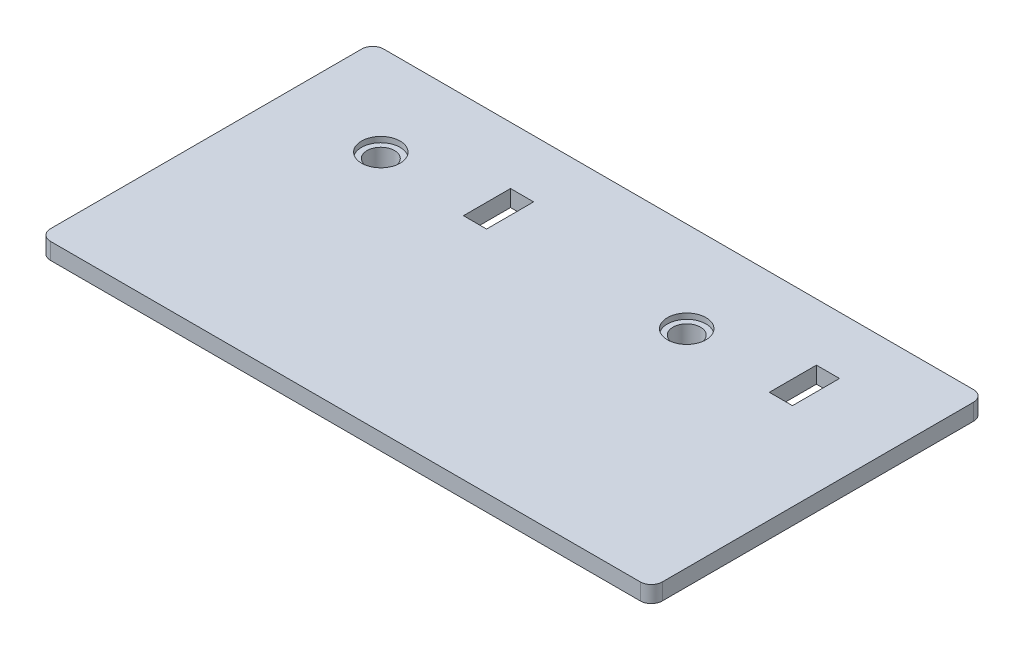
ISO-10303-21;
HEADER;
FILE_DESCRIPTION(('STEP AP214'),'2;1');
FILE_NAME('part.step','',(''),(''),'','','');
FILE_SCHEMA(('AUTOMOTIVE_DESIGN { 1 0 10303 214 1 1 1 1 }'));
ENDSEC;
DATA;
#1=APPLICATION_CONTEXT('core data for automotive mechanical design processes');
#2=APPLICATION_PROTOCOL_DEFINITION('international standard','automotive_design',2000,#1);
#3=PRODUCT_CONTEXT('',#1,'mechanical');
#4=PRODUCT('Part','Part','',(#3));
#5=PRODUCT_RELATED_PRODUCT_CATEGORY('part','',(#4));
#6=PRODUCT_DEFINITION_FORMATION('','',#4);
#7=PRODUCT_DEFINITION_CONTEXT('part definition',#1,'design');
#8=PRODUCT_DEFINITION('design','',#6,#7);
#9=PRODUCT_DEFINITION_SHAPE('','',#8);
#10=(LENGTH_UNIT() NAMED_UNIT(*) SI_UNIT(.MILLI.,.METRE.));
#11=(NAMED_UNIT(*) PLANE_ANGLE_UNIT() SI_UNIT($,.RADIAN.));
#12=(NAMED_UNIT(*) SI_UNIT($,.STERADIAN.) SOLID_ANGLE_UNIT());
#13=UNCERTAINTY_MEASURE_WITH_UNIT(LENGTH_MEASURE(1.E-05),#10,'distance_accuracy_value','');
#14=(GEOMETRIC_REPRESENTATION_CONTEXT(3) GLOBAL_UNCERTAINTY_ASSIGNED_CONTEXT((#13)) GLOBAL_UNIT_ASSIGNED_CONTEXT((#10,
#11,#12)) REPRESENTATION_CONTEXT('',''));
#15=CARTESIAN_POINT('',(0.,0.,0.));
#16=DIRECTION('',(0.,0.,1.));
#17=DIRECTION('',(1.,0.,0.));
#18=AXIS2_PLACEMENT_3D('',#15,#16,#17);
#19=CARTESIAN_POINT('',(0.,0.,0.));
#20=DIRECTION('',(0.,1.,0.));
#21=DIRECTION('',(0.,0.,1.));
#22=AXIS2_PLACEMENT_3D('',#19,#20,#21);
#23=PLANE('',#22);
#24=CARTESIAN_POINT('',(17.95,0.,-13.78));
#25=DIRECTION('',(0.,1.,0.));
#26=DIRECTION('',(0.,0.,1.));
#27=AXIS2_PLACEMENT_3D('',#24,#25,#26);
#28=CIRCLE('',#27,3.5);
#29=CARTESIAN_POINT('',(17.95,0.,-10.28));
#30=VERTEX_POINT('',#29);
#31=EDGE_CURVE('E43',#30,#30,#28,.F.);
#32=ORIENTED_EDGE('',*,*,#31,.F.);
#33=EDGE_LOOP('',(#32));
#34=FACE_BOUND('',#33,.T.);
#35=DIRECTION('',(1.,0.,0.));
#36=VECTOR('',#35,1.);
#37=CARTESIAN_POINT('',(0.,0.,-11.28));
#38=LINE('',#37,#36);
#39=CARTESIAN_POINT('',(35.45,0.,-11.28));
#40=VERTEX_POINT('',#39);
#41=CARTESIAN_POINT('',(39.65,0.,-11.28));
#42=VERTEX_POINT('',#41);
#43=EDGE_CURVE('E261',#40,#42,#38,.T.);
#44=ORIENTED_EDGE('',*,*,#43,.T.);
#45=DIRECTION('',(0.,0.,-1.));
#46=VECTOR('',#45,1.);
#47=CARTESIAN_POINT('',(39.65,0.,0.));
#48=LINE('',#47,#46);
#49=CARTESIAN_POINT('',(39.65,0.,-19.83));
#50=VERTEX_POINT('',#49);
#51=EDGE_CURVE('E264',#42,#50,#48,.T.);
#52=ORIENTED_EDGE('',*,*,#51,.T.);
#53=DIRECTION('',(-1.,0.,0.));
#54=VECTOR('',#53,1.);
#55=CARTESIAN_POINT('',(0.,0.,-19.83));
#56=LINE('',#55,#54);
#57=CARTESIAN_POINT('',(35.45,0.,-19.83));
#58=VERTEX_POINT('',#57);
#59=EDGE_CURVE('E258',#50,#58,#56,.T.);
#60=ORIENTED_EDGE('',*,*,#59,.T.);
#61=DIRECTION('',(0.,0.,1.));
#62=VECTOR('',#61,1.);
#63=CARTESIAN_POINT('',(35.45,0.,0.));
#64=LINE('',#63,#62);
#65=EDGE_CURVE('E201',#58,#40,#64,.T.);
#66=ORIENTED_EDGE('',*,*,#65,.T.);
#67=EDGE_LOOP('',(#44,#52,#60,#66));
#68=FACE_BOUND('',#67,.T.);
#69=DIRECTION('',(1.,0.,0.));
#70=VECTOR('',#69,1.);
#71=CARTESIAN_POINT('',(0.,0.,-11.28));
#72=LINE('',#71,#70);
#73=CARTESIAN_POINT('',(-20.1,0.,-11.28));
#74=VERTEX_POINT('',#73);
#75=CARTESIAN_POINT('',(-15.9,0.,-11.28));
#76=VERTEX_POINT('',#75);
#77=EDGE_CURVE('E252',#74,#76,#72,.T.);
#78=ORIENTED_EDGE('',*,*,#77,.T.);
#79=DIRECTION('',(0.,0.,-1.));
#80=VECTOR('',#79,1.);
#81=CARTESIAN_POINT('',(-15.9,0.,0.));
#82=LINE('',#81,#80);
#83=CARTESIAN_POINT('',(-15.9,0.,-19.83));
#84=VERTEX_POINT('',#83);
#85=EDGE_CURVE('E255',#76,#84,#82,.T.);
#86=ORIENTED_EDGE('',*,*,#85,.T.);
#87=DIRECTION('',(-1.,0.,0.));
#88=VECTOR('',#87,1.);
#89=CARTESIAN_POINT('',(0.,0.,-19.83));
#90=LINE('',#89,#88);
#91=CARTESIAN_POINT('',(-20.1,0.,-19.83));
#92=VERTEX_POINT('',#91);
#93=EDGE_CURVE('E225',#84,#92,#90,.T.);
#94=ORIENTED_EDGE('',*,*,#93,.T.);
#95=DIRECTION('',(0.,0.,1.));
#96=VECTOR('',#95,1.);
#97=CARTESIAN_POINT('',(-20.1,0.,0.));
#98=LINE('',#97,#96);
#99=EDGE_CURVE('E249',#92,#74,#98,.T.);
#100=ORIENTED_EDGE('',*,*,#99,.T.);
#101=EDGE_LOOP('',(#78,#86,#94,#100));
#102=FACE_BOUND('',#101,.T.);
#103=DIRECTION('',(0.,0.,1.));
#104=VECTOR('',#103,1.);
#105=CARTESIAN_POINT('',(-45.55,0.,-23.25));
#106=LINE('',#105,#104);
#107=CARTESIAN_POINT('',(-45.55,0.,-27.25));
#108=VERTEX_POINT('',#107);
#109=CARTESIAN_POINT('',(-45.55,0.,-23.25));
#110=VERTEX_POINT('',#109);
#111=EDGE_CURVE('E300',#108,#110,#106,.T.);
#112=ORIENTED_EDGE('',*,*,#111,.F.);
#113=DIRECTION('',(1.,0.,0.));
#114=VECTOR('',#113,1.);
#115=CARTESIAN_POINT('',(-50.55,0.,-27.25));
#116=LINE('',#115,#114);
#117=CARTESIAN_POINT('',(-50.55,0.,-27.25));
#118=VERTEX_POINT('',#117);
#119=EDGE_CURVE('E305',#118,#108,#116,.T.);
#120=ORIENTED_EDGE('',*,*,#119,.F.);
#121=DIRECTION('',(0.,0.,-1.));
#122=VECTOR('',#121,1.);
#123=CARTESIAN_POINT('',(-50.55,0.,-23.25));
#124=LINE('',#123,#122);
#125=CARTESIAN_POINT('',(-50.55,0.,-23.25));
#126=VERTEX_POINT('',#125);
#127=EDGE_CURVE('E317',#126,#118,#124,.T.);
#128=ORIENTED_EDGE('',*,*,#127,.F.);
#129=DIRECTION('',(-1.,0.,0.));
#130=VECTOR('',#129,1.);
#131=CARTESIAN_POINT('',(-50.55,0.,-23.25));
#132=LINE('',#131,#130);
#133=EDGE_CURVE('E314',#110,#126,#132,.T.);
#134=ORIENTED_EDGE('',*,*,#133,.F.);
#135=EDGE_LOOP('',(#112,#120,#128,#134));
#136=FACE_BOUND('',#135,.T.);
#137=DIRECTION('',(0.,0.,1.));
#138=VECTOR('',#137,1.);
#139=CARTESIAN_POINT('',(-55.55,0.,30.25));
#140=LINE('',#139,#138);
#141=CARTESIAN_POINT('',(-55.55,0.,-28.25));
#142=VERTEX_POINT('',#141);
#143=CARTESIAN_POINT('',(-55.55,0.,28.25));
#144=VERTEX_POINT('',#143);
#145=EDGE_CURVE('E333',#142,#144,#140,.T.);
#146=ORIENTED_EDGE('',*,*,#145,.F.);
#147=CARTESIAN_POINT('',(-53.55,0.,-28.25));
#148=DIRECTION('',(0.,1.,0.));
#149=DIRECTION('',(0.,0.,1.));
#150=AXIS2_PLACEMENT_3D('',#147,#148,#149);
#151=CIRCLE('',#150,2.);
#152=CARTESIAN_POINT('',(-53.55,0.,-30.25));
#153=VERTEX_POINT('',#152);
#154=EDGE_CURVE('E368',#142,#153,#151,.F.);
#155=ORIENTED_EDGE('',*,*,#154,.T.);
#156=DIRECTION('',(-1.,0.,0.));
#157=VECTOR('',#156,1.);
#158=CARTESIAN_POINT('',(55.55,0.,-30.25));
#159=LINE('',#158,#157);
#160=CARTESIAN_POINT('',(53.55,0.,-30.25));
#161=VERTEX_POINT('',#160);
#162=EDGE_CURVE('E338',#161,#153,#159,.T.);
#163=ORIENTED_EDGE('',*,*,#162,.F.);
#164=CARTESIAN_POINT('',(53.55,0.,-28.25));
#165=DIRECTION('',(0.,1.,0.));
#166=DIRECTION('',(0.,0.,1.));
#167=AXIS2_PLACEMENT_3D('',#164,#165,#166);
#168=CIRCLE('',#167,2.);
#169=CARTESIAN_POINT('',(55.55,0.,-28.25));
#170=VERTEX_POINT('',#169);
#171=EDGE_CURVE('E362',#161,#170,#168,.F.);
#172=ORIENTED_EDGE('',*,*,#171,.T.);
#173=DIRECTION('',(0.,0.,-1.));
#174=VECTOR('',#173,1.);
#175=CARTESIAN_POINT('',(55.55,0.,30.25));
#176=LINE('',#175,#174);
#177=CARTESIAN_POINT('',(55.55,0.,28.25));
#178=VERTEX_POINT('',#177);
#179=EDGE_CURVE('E353',#178,#170,#176,.T.);
#180=ORIENTED_EDGE('',*,*,#179,.F.);
#181=CARTESIAN_POINT('',(53.55,0.,28.25));
#182=DIRECTION('',(0.,1.,0.));
#183=DIRECTION('',(0.,0.,1.));
#184=AXIS2_PLACEMENT_3D('',#181,#182,#183);
#185=CIRCLE('',#184,2.);
#186=CARTESIAN_POINT('',(53.55,0.,30.25));
#187=VERTEX_POINT('',#186);
#188=EDGE_CURVE('E364',#178,#187,#185,.F.);
#189=ORIENTED_EDGE('',*,*,#188,.T.);
#190=DIRECTION('',(1.,0.,0.));
#191=VECTOR('',#190,1.);
#192=CARTESIAN_POINT('',(55.55,0.,30.25));
#193=LINE('',#192,#191);
#194=CARTESIAN_POINT('',(-53.55,0.,30.25));
#195=VERTEX_POINT('',#194);
#196=EDGE_CURVE('E350',#195,#187,#193,.T.);
#197=ORIENTED_EDGE('',*,*,#196,.F.);
#198=CARTESIAN_POINT('',(-53.55,0.,28.25));
#199=DIRECTION('',(0.,1.,0.));
#200=DIRECTION('',(0.,0.,1.));
#201=AXIS2_PLACEMENT_3D('',#198,#199,#200);
#202=CIRCLE('',#201,2.);
#203=EDGE_CURVE('E366',#195,#144,#202,.F.);
#204=ORIENTED_EDGE('',*,*,#203,.T.);
#205=EDGE_LOOP('',(#146,#155,#163,#172,#180,#189,#197,#204));
#206=FACE_BOUND('',#205,.T.);
#207=DIRECTION('',(-1.,0.,0.));
#208=VECTOR('',#207,1.);
#209=CARTESIAN_POINT('',(50.55,0.,-23.25));
#210=LINE('',#209,#208);
#211=CARTESIAN_POINT('',(50.55,0.,-23.25));
#212=VERTEX_POINT('',#211);
#213=CARTESIAN_POINT('',(45.55,0.,-23.25));
#214=VERTEX_POINT('',#213);
#215=EDGE_CURVE('E267',#212,#214,#210,.T.);
#216=ORIENTED_EDGE('',*,*,#215,.F.);
#217=DIRECTION('',(0.,0.,1.));
#218=VECTOR('',#217,1.);
#219=CARTESIAN_POINT('',(50.55,0.,-23.25));
#220=LINE('',#219,#218);
#221=CARTESIAN_POINT('',(50.55,0.,-27.25));
#222=VERTEX_POINT('',#221);
#223=EDGE_CURVE('E272',#222,#212,#220,.T.);
#224=ORIENTED_EDGE('',*,*,#223,.F.);
#225=DIRECTION('',(1.,0.,0.));
#226=VECTOR('',#225,1.);
#227=CARTESIAN_POINT('',(50.55,0.,-27.25));
#228=LINE('',#227,#226);
#229=CARTESIAN_POINT('',(45.55,0.,-27.25));
#230=VERTEX_POINT('',#229);
#231=EDGE_CURVE('E284',#230,#222,#228,.T.);
#232=ORIENTED_EDGE('',*,*,#231,.F.);
#233=DIRECTION('',(0.,0.,-1.));
#234=VECTOR('',#233,1.);
#235=CARTESIAN_POINT('',(45.55,0.,-23.25));
#236=LINE('',#235,#234);
#237=EDGE_CURVE('E281',#214,#230,#236,.T.);
#238=ORIENTED_EDGE('',*,*,#237,.F.);
#239=EDGE_LOOP('',(#216,#224,#232,#238));
#240=FACE_BOUND('',#239,.T.);
#241=CARTESIAN_POINT('',(-37.6,0.,-13.78));
#242=DIRECTION('',(0.,1.,0.));
#243=DIRECTION('',(0.,0.,1.));
#244=AXIS2_PLACEMENT_3D('',#241,#242,#243);
#245=CIRCLE('',#244,3.5);
#246=CARTESIAN_POINT('',(-37.6,0.,-10.28));
#247=VERTEX_POINT('',#246);
#248=EDGE_CURVE('E11',#247,#247,#245,.F.);
#249=ORIENTED_EDGE('',*,*,#248,.F.);
#250=EDGE_LOOP('',(#249));
#251=FACE_BOUND('',#250,.T.);
#252=ADVANCED_FACE('F35',(#34,#68,#102,#136,#206,#240,#251),#23,.F.);
#253=CARTESIAN_POINT('',(17.95,-7.,-13.78));
#254=DIRECTION('',(0.,1.,0.));
#255=DIRECTION('',(0.,0.,1.));
#256=AXIS2_PLACEMENT_3D('',#253,#254,#255);
#257=CYLINDRICAL_SURFACE('',#256,2.5);
#258=CARTESIAN_POINT('',(17.95,2.,-13.78));
#259=DIRECTION('',(0.,1.,0.));
#260=DIRECTION('',(0.,0.,1.));
#261=AXIS2_PLACEMENT_3D('',#258,#259,#260);
#262=CIRCLE('',#261,2.5);
#263=CARTESIAN_POINT('',(17.95,2.,-11.28));
#264=VERTEX_POINT('',#263);
#265=EDGE_CURVE('E231',#264,#264,#262,.F.);
#266=ORIENTED_EDGE('',*,*,#265,.F.);
#267=EDGE_LOOP('',(#266));
#268=FACE_BOUND('',#267,.T.);
#269=CARTESIAN_POINT('',(17.95,-5.,-13.78));
#270=DIRECTION('',(0.,-1.,0.));
#271=DIRECTION('',(0.,0.,-1.));
#272=AXIS2_PLACEMENT_3D('',#269,#270,#271);
#273=CIRCLE('',#272,2.5);
#274=CARTESIAN_POINT('',(17.95,-5.,-16.28));
#275=VERTEX_POINT('',#274);
#276=EDGE_CURVE('E821',#275,#275,#273,.T.);
#277=ORIENTED_EDGE('',*,*,#276,.T.);
#278=EDGE_LOOP('',(#277));
#279=FACE_BOUND('',#278,.T.);
#280=ADVANCED_FACE('F405',(#268,#279),#257,.F.);
#281=CARTESIAN_POINT('',(-37.6,-7.,-13.78));
#282=DIRECTION('',(0.,1.,0.));
#283=DIRECTION('',(0.,0.,1.));
#284=AXIS2_PLACEMENT_3D('',#281,#282,#283);
#285=CYLINDRICAL_SURFACE('',#284,2.5);
#286=CARTESIAN_POINT('',(-37.6,2.,-13.78));
#287=DIRECTION('',(0.,1.,0.));
#288=DIRECTION('',(0.,0.,1.));
#289=AXIS2_PLACEMENT_3D('',#286,#287,#288);
#290=CIRCLE('',#289,2.5);
#291=CARTESIAN_POINT('',(-37.6,2.,-11.28));
#292=VERTEX_POINT('',#291);
#293=EDGE_CURVE('E393',#292,#292,#290,.F.);
#294=ORIENTED_EDGE('',*,*,#293,.F.);
#295=EDGE_LOOP('',(#294));
#296=FACE_BOUND('',#295,.T.);
#297=CARTESIAN_POINT('',(-37.6,-5.,-13.78));
#298=DIRECTION('',(0.,-1.,0.));
#299=DIRECTION('',(0.,0.,-1.));
#300=AXIS2_PLACEMENT_3D('',#297,#298,#299);
#301=CIRCLE('',#300,2.5);
#302=CARTESIAN_POINT('',(-37.6,-5.,-16.28));
#303=VERTEX_POINT('',#302);
#304=EDGE_CURVE('E833',#303,#303,#301,.T.);
#305=ORIENTED_EDGE('',*,*,#304,.T.);
#306=EDGE_LOOP('',(#305));
#307=FACE_BOUND('',#306,.T.);
#308=ADVANCED_FACE('F477',(#296,#307),#285,.F.);
#309=CARTESIAN_POINT('',(-55.55,3.,30.25));
#310=DIRECTION('',(1.,0.,0.));
#311=DIRECTION('',(0.,0.,-1.));
#312=AXIS2_PLACEMENT_3D('',#309,#310,#311);
#313=PLANE('',#312);
#314=DIRECTION('',(0.,0.,1.));
#315=VECTOR('',#314,1.);
#316=CARTESIAN_POINT('',(-55.55,3.,30.25));
#317=LINE('',#316,#315);
#318=CARTESIAN_POINT('',(-55.55,3.,-28.25));
#319=VERTEX_POINT('',#318);
#320=CARTESIAN_POINT('',(-55.55,3.,28.25));
#321=VERTEX_POINT('',#320);
#322=EDGE_CURVE('E334',#319,#321,#317,.T.);
#323=ORIENTED_EDGE('',*,*,#322,.F.);
#324=DIRECTION('',(0.,-1.,0.));
#325=VECTOR('',#324,1.);
#326=CARTESIAN_POINT('',(-55.55,3.,-28.25));
#327=LINE('',#326,#325);
#328=EDGE_CURVE('E359',#319,#142,#327,.T.);
#329=ORIENTED_EDGE('',*,*,#328,.T.);
#330=ORIENTED_EDGE('',*,*,#145,.T.);
#331=DIRECTION('',(0.,-1.,0.));
#332=VECTOR('',#331,1.);
#333=CARTESIAN_POINT('',(-55.55,3.,28.25));
#334=LINE('',#333,#332);
#335=EDGE_CURVE('E347',#144,#321,#334,.F.);
#336=ORIENTED_EDGE('',*,*,#335,.T.);
#337=EDGE_LOOP('',(#323,#329,#330,#336));
#338=FACE_BOUND('',#337,.T.);
#339=ADVANCED_FACE('F480',(#338),#313,.F.);
#340=CARTESIAN_POINT('',(55.55,3.,30.25));
#341=DIRECTION('',(0.,0.,-1.));
#342=DIRECTION('',(-1.,0.,0.));
#343=AXIS2_PLACEMENT_3D('',#340,#341,#342);
#344=PLANE('',#343);
#345=DIRECTION('',(1.,0.,0.));
#346=VECTOR('',#345,1.);
#347=CARTESIAN_POINT('',(55.55,3.,30.25));
#348=LINE('',#347,#346);
#349=CARTESIAN_POINT('',(-53.55,3.,30.25));
#350=VERTEX_POINT('',#349);
#351=CARTESIAN_POINT('',(53.55,3.,30.25));
#352=VERTEX_POINT('',#351);
#353=EDGE_CURVE('E337',#350,#352,#348,.T.);
#354=ORIENTED_EDGE('',*,*,#353,.F.);
#355=DIRECTION('',(0.,-1.,0.));
#356=VECTOR('',#355,1.);
#357=CARTESIAN_POINT('',(-53.55,3.,30.25));
#358=LINE('',#357,#356);
#359=EDGE_CURVE('E385',#350,#195,#358,.T.);
#360=ORIENTED_EDGE('',*,*,#359,.T.);
#361=ORIENTED_EDGE('',*,*,#196,.T.);
#362=DIRECTION('',(0.,-1.,0.));
#363=VECTOR('',#362,1.);
#364=CARTESIAN_POINT('',(53.55,3.,30.25));
#365=LINE('',#364,#363);
#366=EDGE_CURVE('E383',#187,#352,#365,.F.);
#367=ORIENTED_EDGE('',*,*,#366,.T.);
#368=EDGE_LOOP('',(#354,#360,#361,#367));
#369=FACE_BOUND('',#368,.T.);
#370=ADVANCED_FACE('F536',(#369),#344,.F.);
#371=CARTESIAN_POINT('',(55.55,3.,30.25));
#372=DIRECTION('',(-1.,0.,0.));
#373=DIRECTION('',(0.,0.,1.));
#374=AXIS2_PLACEMENT_3D('',#371,#372,#373);
#375=PLANE('',#374);
#376=DIRECTION('',(0.,0.,-1.));
#377=VECTOR('',#376,1.);
#378=CARTESIAN_POINT('',(55.55,3.,30.25));
#379=LINE('',#378,#377);
#380=CARTESIAN_POINT('',(55.55,3.,28.25));
#381=VERTEX_POINT('',#380);
#382=CARTESIAN_POINT('',(55.55,3.,-28.25));
#383=VERTEX_POINT('',#382);
#384=EDGE_CURVE('E341',#381,#383,#379,.T.);
#385=ORIENTED_EDGE('',*,*,#384,.F.);
#386=DIRECTION('',(0.,-1.,0.));
#387=VECTOR('',#386,1.);
#388=CARTESIAN_POINT('',(55.55,3.,28.25));
#389=LINE('',#388,#387);
#390=EDGE_CURVE('E390',#381,#178,#389,.T.);
#391=ORIENTED_EDGE('',*,*,#390,.T.);
#392=ORIENTED_EDGE('',*,*,#179,.T.);
#393=DIRECTION('',(0.,-1.,0.));
#394=VECTOR('',#393,1.);
#395=CARTESIAN_POINT('',(55.55,3.,-28.25));
#396=LINE('',#395,#394);
#397=EDGE_CURVE('E388',#170,#383,#396,.F.);
#398=ORIENTED_EDGE('',*,*,#397,.T.);
#399=EDGE_LOOP('',(#385,#391,#392,#398));
#400=FACE_BOUND('',#399,.T.);
#401=ADVANCED_FACE('F532',(#400),#375,.F.);
#402=CARTESIAN_POINT('',(55.55,3.,-30.25));
#403=DIRECTION('',(0.,0.,1.));
#404=DIRECTION('',(1.,0.,0.));
#405=AXIS2_PLACEMENT_3D('',#402,#403,#404);
#406=PLANE('',#405);
#407=ORIENTED_EDGE('',*,*,#162,.T.);
#408=DIRECTION('',(0.,-1.,0.));
#409=VECTOR('',#408,1.);
#410=CARTESIAN_POINT('',(-53.55,3.,-30.25));
#411=LINE('',#410,#409);
#412=CARTESIAN_POINT('',(-53.55,3.,-30.25));
#413=VERTEX_POINT('',#412);
#414=EDGE_CURVE('E373',#153,#413,#411,.F.);
#415=ORIENTED_EDGE('',*,*,#414,.T.);
#416=DIRECTION('',(-1.,0.,0.));
#417=VECTOR('',#416,1.);
#418=CARTESIAN_POINT('',(55.55,3.,-30.25));
#419=LINE('',#418,#417);
#420=CARTESIAN_POINT('',(53.55,3.,-30.25));
#421=VERTEX_POINT('',#420);
#422=EDGE_CURVE('E344',#421,#413,#419,.T.);
#423=ORIENTED_EDGE('',*,*,#422,.F.);
#424=DIRECTION('',(0.,-1.,0.));
#425=VECTOR('',#424,1.);
#426=CARTESIAN_POINT('',(53.55,3.,-30.25));
#427=LINE('',#426,#425);
#428=EDGE_CURVE('E370',#421,#161,#427,.T.);
#429=ORIENTED_EDGE('',*,*,#428,.T.);
#430=EDGE_LOOP('',(#407,#415,#423,#429));
#431=FACE_BOUND('',#430,.T.);
#432=ADVANCED_FACE('F527',(#431),#406,.F.);
#433=CARTESIAN_POINT('',(0.,3.,0.));
#434=DIRECTION('',(0.,1.,0.));
#435=DIRECTION('',(0.,0.,1.));
#436=AXIS2_PLACEMENT_3D('',#433,#434,#435);
#437=PLANE('',#436);
#438=CARTESIAN_POINT('',(-37.6,3.,-13.78));
#439=DIRECTION('',(0.,1.,0.));
#440=DIRECTION('',(0.,0.,1.));
#441=AXIS2_PLACEMENT_3D('',#438,#439,#440);
#442=CIRCLE('',#441,3.5);
#443=CARTESIAN_POINT('',(-37.6,3.,-10.28));
#444=VERTEX_POINT('',#443);
#445=EDGE_CURVE('E810',#444,#444,#442,.T.);
#446=ORIENTED_EDGE('',*,*,#445,.F.);
#447=EDGE_LOOP('',(#446));
#448=FACE_BOUND('',#447,.T.);
#449=CARTESIAN_POINT('',(17.95,3.,-13.78));
#450=DIRECTION('',(0.,1.,0.));
#451=DIRECTION('',(0.,0.,1.));
#452=AXIS2_PLACEMENT_3D('',#449,#450,#451);
#453=CIRCLE('',#452,3.5);
#454=CARTESIAN_POINT('',(17.95,3.,-10.28));
#455=VERTEX_POINT('',#454);
#456=EDGE_CURVE('E813',#455,#455,#453,.T.);
#457=ORIENTED_EDGE('',*,*,#456,.F.);
#458=EDGE_LOOP('',(#457));
#459=FACE_BOUND('',#458,.T.);
#460=DIRECTION('',(0.,0.,-1.));
#461=VECTOR('',#460,1.);
#462=CARTESIAN_POINT('',(39.65,3.,-11.28));
#463=LINE('',#462,#461);
#464=CARTESIAN_POINT('',(39.65,3.,-11.28));
#465=VERTEX_POINT('',#464);
#466=CARTESIAN_POINT('',(39.65,3.,-19.83));
#467=VERTEX_POINT('',#466);
#468=EDGE_CURVE('E213',#465,#467,#463,.T.);
#469=ORIENTED_EDGE('',*,*,#468,.F.);
#470=DIRECTION('',(1.,0.,0.));
#471=VECTOR('',#470,1.);
#472=CARTESIAN_POINT('',(39.65,3.,-11.28));
#473=LINE('',#472,#471);
#474=CARTESIAN_POINT('',(35.45,3.,-11.28));
#475=VERTEX_POINT('',#474);
#476=EDGE_CURVE('E218',#475,#465,#473,.T.);
#477=ORIENTED_EDGE('',*,*,#476,.F.);
#478=DIRECTION('',(0.,0.,1.));
#479=VECTOR('',#478,1.);
#480=CARTESIAN_POINT('',(35.45,3.,-11.28));
#481=LINE('',#480,#479);
#482=CARTESIAN_POINT('',(35.45,3.,-19.83));
#483=VERTEX_POINT('',#482);
#484=EDGE_CURVE('E198',#483,#475,#481,.T.);
#485=ORIENTED_EDGE('',*,*,#484,.F.);
#486=DIRECTION('',(-1.,0.,0.));
#487=VECTOR('',#486,1.);
#488=CARTESIAN_POINT('',(39.65,3.,-19.83));
#489=LINE('',#488,#487);
#490=EDGE_CURVE('E208',#467,#483,#489,.T.);
#491=ORIENTED_EDGE('',*,*,#490,.F.);
#492=EDGE_LOOP('',(#469,#477,#485,#491));
#493=FACE_BOUND('',#492,.T.);
#494=DIRECTION('',(0.,0.,-1.));
#495=VECTOR('',#494,1.);
#496=CARTESIAN_POINT('',(-15.9,3.,-11.28));
#497=LINE('',#496,#495);
#498=CARTESIAN_POINT('',(-15.9,3.,-11.28));
#499=VERTEX_POINT('',#498);
#500=CARTESIAN_POINT('',(-15.9,3.,-19.83));
#501=VERTEX_POINT('',#500);
#502=EDGE_CURVE('E228',#499,#501,#497,.T.);
#503=ORIENTED_EDGE('',*,*,#502,.F.);
#504=DIRECTION('',(1.,0.,0.));
#505=VECTOR('',#504,1.);
#506=CARTESIAN_POINT('',(-15.9,3.,-11.28));
#507=LINE('',#506,#505);
#508=CARTESIAN_POINT('',(-20.1,3.,-11.28));
#509=VERTEX_POINT('',#508);
#510=EDGE_CURVE('E236',#509,#499,#507,.T.);
#511=ORIENTED_EDGE('',*,*,#510,.F.);
#512=DIRECTION('',(0.,0.,1.));
#513=VECTOR('',#512,1.);
#514=CARTESIAN_POINT('',(-20.1,3.,-11.28));
#515=LINE('',#514,#513);
#516=CARTESIAN_POINT('',(-20.1,3.,-19.83));
#517=VERTEX_POINT('',#516);
#518=EDGE_CURVE('E233',#517,#509,#515,.T.);
#519=ORIENTED_EDGE('',*,*,#518,.F.);
#520=DIRECTION('',(-1.,0.,0.));
#521=VECTOR('',#520,1.);
#522=CARTESIAN_POINT('',(-15.9,3.,-19.83));
#523=LINE('',#522,#521);
#524=EDGE_CURVE('E230',#501,#517,#523,.T.);
#525=ORIENTED_EDGE('',*,*,#524,.F.);
#526=EDGE_LOOP('',(#503,#511,#519,#525));
#527=FACE_BOUND('',#526,.T.);
#528=ORIENTED_EDGE('',*,*,#422,.T.);
#529=CARTESIAN_POINT('',(-53.55,3.,-28.25));
#530=DIRECTION('',(0.,1.,0.));
#531=DIRECTION('',(0.,0.,1.));
#532=AXIS2_PLACEMENT_3D('',#529,#530,#531);
#533=CIRCLE('',#532,2.);
#534=EDGE_CURVE('E381',#413,#319,#533,.T.);
#535=ORIENTED_EDGE('',*,*,#534,.T.);
#536=ORIENTED_EDGE('',*,*,#322,.T.);
#537=CARTESIAN_POINT('',(-53.55,3.,28.25));
#538=DIRECTION('',(0.,1.,0.));
#539=DIRECTION('',(0.,0.,1.));
#540=AXIS2_PLACEMENT_3D('',#537,#538,#539);
#541=CIRCLE('',#540,2.);
#542=EDGE_CURVE('E379',#321,#350,#541,.T.);
#543=ORIENTED_EDGE('',*,*,#542,.T.);
#544=ORIENTED_EDGE('',*,*,#353,.T.);
#545=CARTESIAN_POINT('',(53.55,3.,28.25));
#546=DIRECTION('',(0.,1.,0.));
#547=DIRECTION('',(0.,0.,1.));
#548=AXIS2_PLACEMENT_3D('',#545,#546,#547);
#549=CIRCLE('',#548,2.);
#550=EDGE_CURVE('E377',#352,#381,#549,.T.);
#551=ORIENTED_EDGE('',*,*,#550,.T.);
#552=ORIENTED_EDGE('',*,*,#384,.T.);
#553=CARTESIAN_POINT('',(53.55,3.,-28.25));
#554=DIRECTION('',(0.,1.,0.));
#555=DIRECTION('',(0.,0.,1.));
#556=AXIS2_PLACEMENT_3D('',#553,#554,#555);
#557=CIRCLE('',#556,2.);
#558=EDGE_CURVE('E375',#383,#421,#557,.T.);
#559=ORIENTED_EDGE('',*,*,#558,.T.);
#560=EDGE_LOOP('',(#528,#535,#536,#543,#544,#551,#552,#559));
#561=FACE_BOUND('',#560,.T.);
#562=ADVANCED_FACE('F215',(#448,#459,#493,#527,#561),#437,.T.);
#563=CARTESIAN_POINT('',(-45.55,-3.,-23.25));
#564=DIRECTION('',(-1.,0.,0.));
#565=DIRECTION('',(0.,0.,1.));
#566=AXIS2_PLACEMENT_3D('',#563,#564,#565);
#567=PLANE('',#566);
#568=ORIENTED_EDGE('',*,*,#111,.T.);
#569=DIRECTION('',(0.,1.,0.));
#570=VECTOR('',#569,1.);
#571=CARTESIAN_POINT('',(-45.55,-3.,-23.25));
#572=LINE('',#571,#570);
#573=CARTESIAN_POINT('',(-45.55,-3.,-23.25));
#574=VERTEX_POINT('',#573);
#575=EDGE_CURVE('E330',#574,#110,#572,.T.);
#576=ORIENTED_EDGE('',*,*,#575,.F.);
#577=DIRECTION('',(0.,0.,1.));
#578=VECTOR('',#577,1.);
#579=CARTESIAN_POINT('',(-45.55,-3.,-23.25));
#580=LINE('',#579,#578);
#581=CARTESIAN_POINT('',(-45.55,-3.,-27.25));
#582=VERTEX_POINT('',#581);
#583=EDGE_CURVE('E301',#582,#574,#580,.T.);
#584=ORIENTED_EDGE('',*,*,#583,.F.);
#585=DIRECTION('',(0.,1.,0.));
#586=VECTOR('',#585,1.);
#587=CARTESIAN_POINT('',(-45.55,-3.,-27.25));
#588=LINE('',#587,#586);
#589=EDGE_CURVE('E311',#582,#108,#588,.T.);
#590=ORIENTED_EDGE('',*,*,#589,.T.);
#591=EDGE_LOOP('',(#568,#576,#584,#590));
#592=FACE_BOUND('',#591,.T.);
#593=ADVANCED_FACE('F521',(#592),#567,.F.);
#594=CARTESIAN_POINT('',(-50.55,-3.,-23.25));
#595=DIRECTION('',(0.,0.,-1.));
#596=DIRECTION('',(-1.,0.,0.));
#597=AXIS2_PLACEMENT_3D('',#594,#595,#596);
#598=PLANE('',#597);
#599=ORIENTED_EDGE('',*,*,#133,.T.);
#600=DIRECTION('',(0.,1.,0.));
#601=VECTOR('',#600,1.);
#602=CARTESIAN_POINT('',(-50.55,-3.,-23.25));
#603=LINE('',#602,#601);
#604=CARTESIAN_POINT('',(-50.55,-3.,-23.25));
#605=VERTEX_POINT('',#604);
#606=EDGE_CURVE('E327',#605,#126,#603,.T.);
#607=ORIENTED_EDGE('',*,*,#606,.F.);
#608=DIRECTION('',(-1.,0.,0.));
#609=VECTOR('',#608,1.);
#610=CARTESIAN_POINT('',(-50.55,-3.,-23.25));
#611=LINE('',#610,#609);
#612=EDGE_CURVE('E304',#574,#605,#611,.T.);
#613=ORIENTED_EDGE('',*,*,#612,.F.);
#614=ORIENTED_EDGE('',*,*,#575,.T.);
#615=EDGE_LOOP('',(#599,#607,#613,#614));
#616=FACE_BOUND('',#615,.T.);
#617=ADVANCED_FACE('F517',(#616),#598,.F.);
#618=CARTESIAN_POINT('',(-50.55,-3.,-23.25));
#619=DIRECTION('',(1.,0.,0.));
#620=DIRECTION('',(0.,0.,-1.));
#621=AXIS2_PLACEMENT_3D('',#618,#619,#620);
#622=PLANE('',#621);
#623=ORIENTED_EDGE('',*,*,#127,.T.);
#624=DIRECTION('',(0.,1.,0.));
#625=VECTOR('',#624,1.);
#626=CARTESIAN_POINT('',(-50.55,-3.,-27.25));
#627=LINE('',#626,#625);
#628=CARTESIAN_POINT('',(-50.55,-3.,-27.25));
#629=VERTEX_POINT('',#628);
#630=EDGE_CURVE('E324',#629,#118,#627,.T.);
#631=ORIENTED_EDGE('',*,*,#630,.F.);
#632=DIRECTION('',(0.,0.,-1.));
#633=VECTOR('',#632,1.);
#634=CARTESIAN_POINT('',(-50.55,-3.,-23.25));
#635=LINE('',#634,#633);
#636=EDGE_CURVE('E307',#605,#629,#635,.T.);
#637=ORIENTED_EDGE('',*,*,#636,.F.);
#638=ORIENTED_EDGE('',*,*,#606,.T.);
#639=EDGE_LOOP('',(#623,#631,#637,#638));
#640=FACE_BOUND('',#639,.T.);
#641=ADVANCED_FACE('F513',(#640),#622,.F.);
#642=CARTESIAN_POINT('',(-50.55,-3.,-27.25));
#643=DIRECTION('',(0.,0.,1.));
#644=DIRECTION('',(1.,0.,0.));
#645=AXIS2_PLACEMENT_3D('',#642,#643,#644);
#646=PLANE('',#645);
#647=ORIENTED_EDGE('',*,*,#119,.T.);
#648=ORIENTED_EDGE('',*,*,#589,.F.);
#649=DIRECTION('',(1.,0.,0.));
#650=VECTOR('',#649,1.);
#651=CARTESIAN_POINT('',(-50.55,-3.,-27.25));
#652=LINE('',#651,#650);
#653=EDGE_CURVE('E309',#629,#582,#652,.T.);
#654=ORIENTED_EDGE('',*,*,#653,.F.);
#655=ORIENTED_EDGE('',*,*,#630,.T.);
#656=EDGE_LOOP('',(#647,#648,#654,#655));
#657=FACE_BOUND('',#656,.T.);
#658=ADVANCED_FACE('F509',(#657),#646,.F.);
#659=CARTESIAN_POINT('',(0.,-3.,0.));
#660=DIRECTION('',(0.,-1.,0.));
#661=DIRECTION('',(0.,0.,-1.));
#662=AXIS2_PLACEMENT_3D('',#659,#660,#661);
#663=PLANE('',#662);
#664=ORIENTED_EDGE('',*,*,#583,.T.);
#665=ORIENTED_EDGE('',*,*,#612,.T.);
#666=ORIENTED_EDGE('',*,*,#636,.T.);
#667=ORIENTED_EDGE('',*,*,#653,.T.);
#668=EDGE_LOOP('',(#664,#665,#666,#667));
#669=FACE_BOUND('',#668,.T.);
#670=ADVANCED_FACE('F505',(#669),#663,.T.);
#671=CARTESIAN_POINT('',(50.55,-3.,-23.25));
#672=DIRECTION('',(0.,0.,-1.));
#673=DIRECTION('',(-1.,0.,0.));
#674=AXIS2_PLACEMENT_3D('',#671,#672,#673);
#675=PLANE('',#674);
#676=ORIENTED_EDGE('',*,*,#215,.T.);
#677=DIRECTION('',(0.,1.,0.));
#678=VECTOR('',#677,1.);
#679=CARTESIAN_POINT('',(45.55,-3.,-23.25));
#680=LINE('',#679,#678);
#681=CARTESIAN_POINT('',(45.55,-3.,-23.25));
#682=VERTEX_POINT('',#681);
#683=EDGE_CURVE('E297',#682,#214,#680,.T.);
#684=ORIENTED_EDGE('',*,*,#683,.F.);
#685=DIRECTION('',(-1.,0.,0.));
#686=VECTOR('',#685,1.);
#687=CARTESIAN_POINT('',(50.55,-3.,-23.25));
#688=LINE('',#687,#686);
#689=CARTESIAN_POINT('',(50.55,-3.,-23.25));
#690=VERTEX_POINT('',#689);
#691=EDGE_CURVE('E268',#690,#682,#688,.T.);
#692=ORIENTED_EDGE('',*,*,#691,.F.);
#693=DIRECTION('',(0.,1.,0.));
#694=VECTOR('',#693,1.);
#695=CARTESIAN_POINT('',(50.55,-3.,-23.25));
#696=LINE('',#695,#694);
#697=EDGE_CURVE('E278',#690,#212,#696,.T.);
#698=ORIENTED_EDGE('',*,*,#697,.T.);
#699=EDGE_LOOP('',(#676,#684,#692,#698));
#700=FACE_BOUND('',#699,.T.);
#701=ADVANCED_FACE('F501',(#700),#675,.F.);
#702=CARTESIAN_POINT('',(45.55,-3.,-23.25));
#703=DIRECTION('',(1.,0.,0.));
#704=DIRECTION('',(0.,0.,-1.));
#705=AXIS2_PLACEMENT_3D('',#702,#703,#704);
#706=PLANE('',#705);
#707=ORIENTED_EDGE('',*,*,#237,.T.);
#708=DIRECTION('',(0.,1.,0.));
#709=VECTOR('',#708,1.);
#710=CARTESIAN_POINT('',(45.55,-3.,-27.25));
#711=LINE('',#710,#709);
#712=CARTESIAN_POINT('',(45.55,-3.,-27.25));
#713=VERTEX_POINT('',#712);
#714=EDGE_CURVE('E294',#713,#230,#711,.T.);
#715=ORIENTED_EDGE('',*,*,#714,.F.);
#716=DIRECTION('',(0.,0.,-1.));
#717=VECTOR('',#716,1.);
#718=CARTESIAN_POINT('',(45.55,-3.,-23.25));
#719=LINE('',#718,#717);
#720=EDGE_CURVE('E271',#682,#713,#719,.T.);
#721=ORIENTED_EDGE('',*,*,#720,.F.);
#722=ORIENTED_EDGE('',*,*,#683,.T.);
#723=EDGE_LOOP('',(#707,#715,#721,#722));
#724=FACE_BOUND('',#723,.T.);
#725=ADVANCED_FACE('F497',(#724),#706,.F.);
#726=CARTESIAN_POINT('',(50.55,-3.,-27.25));
#727=DIRECTION('',(0.,0.,1.));
#728=DIRECTION('',(1.,0.,0.));
#729=AXIS2_PLACEMENT_3D('',#726,#727,#728);
#730=PLANE('',#729);
#731=ORIENTED_EDGE('',*,*,#231,.T.);
#732=DIRECTION('',(0.,1.,0.));
#733=VECTOR('',#732,1.);
#734=CARTESIAN_POINT('',(50.55,-3.,-27.25));
#735=LINE('',#734,#733);
#736=CARTESIAN_POINT('',(50.55,-3.,-27.25));
#737=VERTEX_POINT('',#736);
#738=EDGE_CURVE('E291',#737,#222,#735,.T.);
#739=ORIENTED_EDGE('',*,*,#738,.F.);
#740=DIRECTION('',(1.,0.,0.));
#741=VECTOR('',#740,1.);
#742=CARTESIAN_POINT('',(50.55,-3.,-27.25));
#743=LINE('',#742,#741);
#744=EDGE_CURVE('E274',#713,#737,#743,.T.);
#745=ORIENTED_EDGE('',*,*,#744,.F.);
#746=ORIENTED_EDGE('',*,*,#714,.T.);
#747=EDGE_LOOP('',(#731,#739,#745,#746));
#748=FACE_BOUND('',#747,.T.);
#749=ADVANCED_FACE('F493',(#748),#730,.F.);
#750=CARTESIAN_POINT('',(50.55,-3.,-23.25));
#751=DIRECTION('',(-1.,0.,0.));
#752=DIRECTION('',(0.,0.,1.));
#753=AXIS2_PLACEMENT_3D('',#750,#751,#752);
#754=PLANE('',#753);
#755=ORIENTED_EDGE('',*,*,#223,.T.);
#756=ORIENTED_EDGE('',*,*,#697,.F.);
#757=DIRECTION('',(0.,0.,1.));
#758=VECTOR('',#757,1.);
#759=CARTESIAN_POINT('',(50.55,-3.,-23.25));
#760=LINE('',#759,#758);
#761=EDGE_CURVE('E276',#737,#690,#760,.T.);
#762=ORIENTED_EDGE('',*,*,#761,.F.);
#763=ORIENTED_EDGE('',*,*,#738,.T.);
#764=EDGE_LOOP('',(#755,#756,#762,#763));
#765=FACE_BOUND('',#764,.T.);
#766=ADVANCED_FACE('F489',(#765),#754,.F.);
#767=CARTESIAN_POINT('',(0.,-3.,0.));
#768=DIRECTION('',(0.,-1.,0.));
#769=DIRECTION('',(0.,0.,-1.));
#770=AXIS2_PLACEMENT_3D('',#767,#768,#769);
#771=PLANE('',#770);
#772=ORIENTED_EDGE('',*,*,#691,.T.);
#773=ORIENTED_EDGE('',*,*,#720,.T.);
#774=ORIENTED_EDGE('',*,*,#744,.T.);
#775=ORIENTED_EDGE('',*,*,#761,.T.);
#776=EDGE_LOOP('',(#772,#773,#774,#775));
#777=FACE_BOUND('',#776,.T.);
#778=ADVANCED_FACE('F485',(#777),#771,.T.);
#779=CARTESIAN_POINT('',(-53.55,3.,-28.25));
#780=DIRECTION('',(0.,-1.,0.));
#781=DIRECTION('',(0.,0.,-1.));
#782=AXIS2_PLACEMENT_3D('',#779,#780,#781);
#783=CYLINDRICAL_SURFACE('',#782,2.);
#784=ORIENTED_EDGE('',*,*,#534,.F.);
#785=ORIENTED_EDGE('',*,*,#414,.F.);
#786=ORIENTED_EDGE('',*,*,#154,.F.);
#787=ORIENTED_EDGE('',*,*,#328,.F.);
#788=EDGE_LOOP('',(#784,#785,#786,#787));
#789=FACE_BOUND('',#788,.T.);
#790=ADVANCED_FACE('F488',(#789),#783,.T.);
#791=CARTESIAN_POINT('',(-53.55,3.,28.25));
#792=DIRECTION('',(0.,-1.,0.));
#793=DIRECTION('',(0.,0.,-1.));
#794=AXIS2_PLACEMENT_3D('',#791,#792,#793);
#795=CYLINDRICAL_SURFACE('',#794,2.);
#796=ORIENTED_EDGE('',*,*,#542,.F.);
#797=ORIENTED_EDGE('',*,*,#335,.F.);
#798=ORIENTED_EDGE('',*,*,#203,.F.);
#799=ORIENTED_EDGE('',*,*,#359,.F.);
#800=EDGE_LOOP('',(#796,#797,#798,#799));
#801=FACE_BOUND('',#800,.T.);
#802=ADVANCED_FACE('F546',(#801),#795,.T.);
#803=CARTESIAN_POINT('',(53.55,3.,28.25));
#804=DIRECTION('',(0.,-1.,0.));
#805=DIRECTION('',(0.,0.,-1.));
#806=AXIS2_PLACEMENT_3D('',#803,#804,#805);
#807=CYLINDRICAL_SURFACE('',#806,2.);
#808=ORIENTED_EDGE('',*,*,#550,.F.);
#809=ORIENTED_EDGE('',*,*,#366,.F.);
#810=ORIENTED_EDGE('',*,*,#188,.F.);
#811=ORIENTED_EDGE('',*,*,#390,.F.);
#812=EDGE_LOOP('',(#808,#809,#810,#811));
#813=FACE_BOUND('',#812,.T.);
#814=ADVANCED_FACE('F549',(#813),#807,.T.);
#815=CARTESIAN_POINT('',(53.55,3.,-28.25));
#816=DIRECTION('',(0.,-1.,0.));
#817=DIRECTION('',(0.,0.,-1.));
#818=AXIS2_PLACEMENT_3D('',#815,#816,#817);
#819=CYLINDRICAL_SURFACE('',#818,2.);
#820=ORIENTED_EDGE('',*,*,#558,.F.);
#821=ORIENTED_EDGE('',*,*,#397,.F.);
#822=ORIENTED_EDGE('',*,*,#171,.F.);
#823=ORIENTED_EDGE('',*,*,#428,.F.);
#824=EDGE_LOOP('',(#820,#821,#822,#823));
#825=FACE_BOUND('',#824,.T.);
#826=ADVANCED_FACE('F37',(#825),#819,.T.);
#827=CARTESIAN_POINT('',(-15.9,-7.,-11.28));
#828=DIRECTION('',(1.,0.,0.));
#829=DIRECTION('',(0.,0.,-1.));
#830=AXIS2_PLACEMENT_3D('',#827,#828,#829);
#831=PLANE('',#830);
#832=DIRECTION('',(0.,1.,0.));
#833=VECTOR('',#832,1.);
#834=CARTESIAN_POINT('',(-15.9,-7.,-11.28));
#835=LINE('',#834,#833);
#836=EDGE_CURVE('E240',#76,#499,#835,.T.);
#837=ORIENTED_EDGE('',*,*,#836,.T.);
#838=ORIENTED_EDGE('',*,*,#502,.T.);
#839=DIRECTION('',(0.,1.,0.));
#840=VECTOR('',#839,1.);
#841=CARTESIAN_POINT('',(-15.9,-7.,-19.83));
#842=LINE('',#841,#840);
#843=EDGE_CURVE('E239',#84,#501,#842,.T.);
#844=ORIENTED_EDGE('',*,*,#843,.F.);
#845=ORIENTED_EDGE('',*,*,#85,.F.);
#846=EDGE_LOOP('',(#837,#838,#844,#845));
#847=FACE_BOUND('',#846,.T.);
#848=ADVANCED_FACE('F467',(#847),#831,.F.);
#849=CARTESIAN_POINT('',(-15.9,-7.,-11.28));
#850=DIRECTION('',(0.,0.,1.));
#851=DIRECTION('',(1.,0.,0.));
#852=AXIS2_PLACEMENT_3D('',#849,#850,#851);
#853=PLANE('',#852);
#854=DIRECTION('',(0.,1.,0.));
#855=VECTOR('',#854,1.);
#856=CARTESIAN_POINT('',(-20.1,-7.,-11.28));
#857=LINE('',#856,#855);
#858=EDGE_CURVE('E242',#74,#509,#857,.T.);
#859=ORIENTED_EDGE('',*,*,#858,.T.);
#860=ORIENTED_EDGE('',*,*,#510,.T.);
#861=ORIENTED_EDGE('',*,*,#836,.F.);
#862=ORIENTED_EDGE('',*,*,#77,.F.);
#863=EDGE_LOOP('',(#859,#860,#861,#862));
#864=FACE_BOUND('',#863,.T.);
#865=ADVANCED_FACE('F463',(#864),#853,.F.);
#866=CARTESIAN_POINT('',(-20.1,-7.,-11.28));
#867=DIRECTION('',(-1.,0.,0.));
#868=DIRECTION('',(0.,0.,1.));
#869=AXIS2_PLACEMENT_3D('',#866,#867,#868);
#870=PLANE('',#869);
#871=DIRECTION('',(0.,1.,0.));
#872=VECTOR('',#871,1.);
#873=CARTESIAN_POINT('',(-20.1,-7.,-19.83));
#874=LINE('',#873,#872);
#875=EDGE_CURVE('E58',#92,#517,#874,.T.);
#876=ORIENTED_EDGE('',*,*,#875,.T.);
#877=ORIENTED_EDGE('',*,*,#518,.T.);
#878=ORIENTED_EDGE('',*,*,#858,.F.);
#879=ORIENTED_EDGE('',*,*,#99,.F.);
#880=EDGE_LOOP('',(#876,#877,#878,#879));
#881=FACE_BOUND('',#880,.T.);
#882=ADVANCED_FACE('F466',(#881),#870,.F.);
#883=CARTESIAN_POINT('',(-15.9,-7.,-19.83));
#884=DIRECTION('',(0.,0.,-1.));
#885=DIRECTION('',(-1.,0.,0.));
#886=AXIS2_PLACEMENT_3D('',#883,#884,#885);
#887=PLANE('',#886);
#888=ORIENTED_EDGE('',*,*,#843,.T.);
#889=ORIENTED_EDGE('',*,*,#524,.T.);
#890=ORIENTED_EDGE('',*,*,#875,.F.);
#891=ORIENTED_EDGE('',*,*,#93,.F.);
#892=EDGE_LOOP('',(#888,#889,#890,#891));
#893=FACE_BOUND('',#892,.T.);
#894=ADVANCED_FACE('F461',(#893),#887,.F.);
#895=CARTESIAN_POINT('',(39.65,-7.,-11.28));
#896=DIRECTION('',(1.,0.,0.));
#897=DIRECTION('',(0.,0.,-1.));
#898=AXIS2_PLACEMENT_3D('',#895,#896,#897);
#899=PLANE('',#898);
#900=DIRECTION('',(0.,1.,0.));
#901=VECTOR('',#900,1.);
#902=CARTESIAN_POINT('',(39.65,-7.,-11.28));
#903=LINE('',#902,#901);
#904=EDGE_CURVE('E223',#42,#465,#903,.T.);
#905=ORIENTED_EDGE('',*,*,#904,.T.);
#906=ORIENTED_EDGE('',*,*,#468,.T.);
#907=DIRECTION('',(0.,1.,0.));
#908=VECTOR('',#907,1.);
#909=CARTESIAN_POINT('',(39.65,-7.,-19.83));
#910=LINE('',#909,#908);
#911=EDGE_CURVE('E204',#50,#467,#910,.T.);
#912=ORIENTED_EDGE('',*,*,#911,.F.);
#913=ORIENTED_EDGE('',*,*,#51,.F.);
#914=EDGE_LOOP('',(#905,#906,#912,#913));
#915=FACE_BOUND('',#914,.T.);
#916=ADVANCED_FACE('F453',(#915),#899,.F.);
#917=CARTESIAN_POINT('',(39.65,-7.,-11.28));
#918=DIRECTION('',(0.,0.,1.));
#919=DIRECTION('',(1.,0.,0.));
#920=AXIS2_PLACEMENT_3D('',#917,#918,#919);
#921=PLANE('',#920);
#922=DIRECTION('',(0.,1.,0.));
#923=VECTOR('',#922,1.);
#924=CARTESIAN_POINT('',(35.45,-7.,-11.28));
#925=LINE('',#924,#923);
#926=EDGE_CURVE('E203',#40,#475,#925,.T.);
#927=ORIENTED_EDGE('',*,*,#926,.T.);
#928=ORIENTED_EDGE('',*,*,#476,.T.);
#929=ORIENTED_EDGE('',*,*,#904,.F.);
#930=ORIENTED_EDGE('',*,*,#43,.F.);
#931=EDGE_LOOP('',(#927,#928,#929,#930));
#932=FACE_BOUND('',#931,.T.);
#933=ADVANCED_FACE('F450',(#932),#921,.F.);
#934=CARTESIAN_POINT('',(35.45,-7.,-11.28));
#935=DIRECTION('',(-1.,0.,0.));
#936=DIRECTION('',(0.,0.,1.));
#937=AXIS2_PLACEMENT_3D('',#934,#935,#936);
#938=PLANE('',#937);
#939=DIRECTION('',(0.,1.,0.));
#940=VECTOR('',#939,1.);
#941=CARTESIAN_POINT('',(35.45,-7.,-19.83));
#942=LINE('',#941,#940);
#943=EDGE_CURVE('E50',#58,#483,#942,.T.);
#944=ORIENTED_EDGE('',*,*,#943,.T.);
#945=ORIENTED_EDGE('',*,*,#484,.T.);
#946=ORIENTED_EDGE('',*,*,#926,.F.);
#947=ORIENTED_EDGE('',*,*,#65,.F.);
#948=EDGE_LOOP('',(#944,#945,#946,#947));
#949=FACE_BOUND('',#948,.T.);
#950=ADVANCED_FACE('F195',(#949),#938,.F.);
#951=CARTESIAN_POINT('',(39.65,-7.,-19.83));
#952=DIRECTION('',(0.,0.,-1.));
#953=DIRECTION('',(-1.,0.,0.));
#954=AXIS2_PLACEMENT_3D('',#951,#952,#953);
#955=PLANE('',#954);
#956=ORIENTED_EDGE('',*,*,#911,.T.);
#957=ORIENTED_EDGE('',*,*,#490,.T.);
#958=ORIENTED_EDGE('',*,*,#943,.F.);
#959=ORIENTED_EDGE('',*,*,#59,.F.);
#960=EDGE_LOOP('',(#956,#957,#958,#959));
#961=FACE_BOUND('',#960,.T.);
#962=ADVANCED_FACE('F209',(#961),#955,.F.);
#963=CARTESIAN_POINT('',(-37.6,2.,-13.78));
#964=DIRECTION('',(0.,1.,0.));
#965=DIRECTION('',(0.,0.,1.));
#966=AXIS2_PLACEMENT_3D('',#963,#964,#965);
#967=PLANE('',#966);
#968=CARTESIAN_POINT('',(-37.6,2.,-13.78));
#969=DIRECTION('',(0.,1.,0.));
#970=DIRECTION('',(0.,0.,1.));
#971=AXIS2_PLACEMENT_3D('',#968,#969,#970);
#972=CIRCLE('',#971,3.5);
#973=CARTESIAN_POINT('',(-37.6,2.,-10.28));
#974=VERTEX_POINT('',#973);
#975=EDGE_CURVE('E396',#974,#974,#972,.T.);
#976=ORIENTED_EDGE('',*,*,#975,.T.);
#977=EDGE_LOOP('',(#976));
#978=FACE_BOUND('',#977,.T.);
#979=ORIENTED_EDGE('',*,*,#293,.T.);
#980=EDGE_LOOP('',(#979));
#981=FACE_BOUND('',#980,.T.);
#982=ADVANCED_FACE('F435',(#978,#981),#967,.T.);
#983=CARTESIAN_POINT('',(-37.6,2.,-13.78));
#984=DIRECTION('',(0.,1.,0.));
#985=DIRECTION('',(0.,0.,1.));
#986=AXIS2_PLACEMENT_3D('',#983,#984,#985);
#987=CYLINDRICAL_SURFACE('',#986,3.5);
#988=ORIENTED_EDGE('',*,*,#975,.F.);
#989=EDGE_LOOP('',(#988));
#990=FACE_BOUND('',#989,.T.);
#991=ORIENTED_EDGE('',*,*,#445,.T.);
#992=EDGE_LOOP('',(#991));
#993=FACE_BOUND('',#992,.T.);
#994=ADVANCED_FACE('F438',(#990,#993),#987,.F.);
#995=CARTESIAN_POINT('',(17.95,2.,-13.78));
#996=DIRECTION('',(0.,1.,0.));
#997=DIRECTION('',(0.,0.,1.));
#998=AXIS2_PLACEMENT_3D('',#995,#996,#997);
#999=PLANE('',#998);
#1000=CARTESIAN_POINT('',(17.95,2.,-13.78));
#1001=DIRECTION('',(0.,1.,0.));
#1002=DIRECTION('',(0.,0.,1.));
#1003=AXIS2_PLACEMENT_3D('',#1000,#1001,#1002);
#1004=CIRCLE('',#1003,3.5);
#1005=CARTESIAN_POINT('',(17.95,2.,-10.28));
#1006=VERTEX_POINT('',#1005);
#1007=EDGE_CURVE('E815',#1006,#1006,#1004,.T.);
#1008=ORIENTED_EDGE('',*,*,#1007,.T.);
#1009=EDGE_LOOP('',(#1008));
#1010=FACE_BOUND('',#1009,.T.);
#1011=ORIENTED_EDGE('',*,*,#265,.T.);
#1012=EDGE_LOOP('',(#1011));
#1013=FACE_BOUND('',#1012,.T.);
#1014=ADVANCED_FACE('F442',(#1010,#1013),#999,.T.);
#1015=CARTESIAN_POINT('',(17.95,2.,-13.78));
#1016=DIRECTION('',(0.,1.,0.));
#1017=DIRECTION('',(0.,0.,1.));
#1018=AXIS2_PLACEMENT_3D('',#1015,#1016,#1017);
#1019=CYLINDRICAL_SURFACE('',#1018,3.5);
#1020=ORIENTED_EDGE('',*,*,#1007,.F.);
#1021=EDGE_LOOP('',(#1020));
#1022=FACE_BOUND('',#1021,.T.);
#1023=ORIENTED_EDGE('',*,*,#456,.T.);
#1024=EDGE_LOOP('',(#1023));
#1025=FACE_BOUND('',#1024,.T.);
#1026=ADVANCED_FACE('F430',(#1022,#1025),#1019,.F.);
#1027=CARTESIAN_POINT('',(17.95,-5.,-13.78));
#1028=DIRECTION('',(0.,-1.,0.));
#1029=DIRECTION('',(0.,0.,-1.));
#1030=AXIS2_PLACEMENT_3D('',#1027,#1028,#1029);
#1031=PLANE('',#1030);
#1032=CARTESIAN_POINT('',(17.95,-5.,-13.78));
#1033=DIRECTION('',(0.,-1.,0.));
#1034=DIRECTION('',(0.,0.,-1.));
#1035=AXIS2_PLACEMENT_3D('',#1032,#1033,#1034);
#1036=CIRCLE('',#1035,3.5);
#1037=CARTESIAN_POINT('',(17.95,-5.,-17.28));
#1038=VERTEX_POINT('',#1037);
#1039=EDGE_CURVE('E816',#1038,#1038,#1036,.T.);
#1040=ORIENTED_EDGE('',*,*,#1039,.T.);
#1041=EDGE_LOOP('',(#1040));
#1042=FACE_BOUND('',#1041,.T.);
#1043=ORIENTED_EDGE('',*,*,#276,.F.);
#1044=EDGE_LOOP('',(#1043));
#1045=FACE_BOUND('',#1044,.T.);
#1046=ADVANCED_FACE('F427',(#1042,#1045),#1031,.T.);
#1047=CARTESIAN_POINT('',(17.95,-5.,-13.78));
#1048=DIRECTION('',(0.,1.,0.));
#1049=DIRECTION('',(0.,0.,1.));
#1050=AXIS2_PLACEMENT_3D('',#1047,#1048,#1049);
#1051=CYLINDRICAL_SURFACE('',#1050,3.5);
#1052=ORIENTED_EDGE('',*,*,#1039,.F.);
#1053=EDGE_LOOP('',(#1052));
#1054=FACE_BOUND('',#1053,.T.);
#1055=ORIENTED_EDGE('',*,*,#31,.T.);
#1056=EDGE_LOOP('',(#1055));
#1057=FACE_BOUND('',#1056,.T.);
#1058=ADVANCED_FACE('F401',(#1054,#1057),#1051,.T.);
#1059=CARTESIAN_POINT('',(-37.6,-5.,-13.78));
#1060=DIRECTION('',(0.,-1.,0.));
#1061=DIRECTION('',(0.,0.,-1.));
#1062=AXIS2_PLACEMENT_3D('',#1059,#1060,#1061);
#1063=PLANE('',#1062);
#1064=CARTESIAN_POINT('',(-37.6,-5.,-13.78));
#1065=DIRECTION('',(0.,-1.,0.));
#1066=DIRECTION('',(0.,0.,-1.));
#1067=AXIS2_PLACEMENT_3D('',#1064,#1065,#1066);
#1068=CIRCLE('',#1067,3.5);
#1069=CARTESIAN_POINT('',(-37.6,-5.,-17.28));
#1070=VERTEX_POINT('',#1069);
#1071=EDGE_CURVE('E830',#1070,#1070,#1068,.T.);
#1072=ORIENTED_EDGE('',*,*,#1071,.T.);
#1073=EDGE_LOOP('',(#1072));
#1074=FACE_BOUND('',#1073,.T.);
#1075=ORIENTED_EDGE('',*,*,#304,.F.);
#1076=EDGE_LOOP('',(#1075));
#1077=FACE_BOUND('',#1076,.T.);
#1078=ADVANCED_FACE('F417',(#1074,#1077),#1063,.T.);
#1079=CARTESIAN_POINT('',(-37.6,-5.,-13.78));
#1080=DIRECTION('',(0.,1.,0.));
#1081=DIRECTION('',(0.,0.,1.));
#1082=AXIS2_PLACEMENT_3D('',#1079,#1080,#1081);
#1083=CYLINDRICAL_SURFACE('',#1082,3.5);
#1084=ORIENTED_EDGE('',*,*,#1071,.F.);
#1085=EDGE_LOOP('',(#1084));
#1086=FACE_BOUND('',#1085,.T.);
#1087=ORIENTED_EDGE('',*,*,#248,.T.);
#1088=EDGE_LOOP('',(#1087));
#1089=FACE_BOUND('',#1088,.T.);
#1090=ADVANCED_FACE('F415',(#1086,#1089),#1083,.T.);
#1091=CLOSED_SHELL('',(#252,#280,#308,#339,#370,#401,#432,#562,#593,#617,#641,#658,#670,#701,
#725,#749,#766,#778,#790,#802,#814,#826,#848,#865,#882,#894,#916,#933,#950,#962,#982,#994,#1014,
#1026,#1046,#1058,#1078,#1090));
#1092=MANIFOLD_SOLID_BREP('B2',#1091);
#1093=ADVANCED_BREP_SHAPE_REPRESENTATION('',(#18,#1092),#14);
#1094=SHAPE_DEFINITION_REPRESENTATION(#9,#1093);
ENDSEC;
END-ISO-10303-21;
